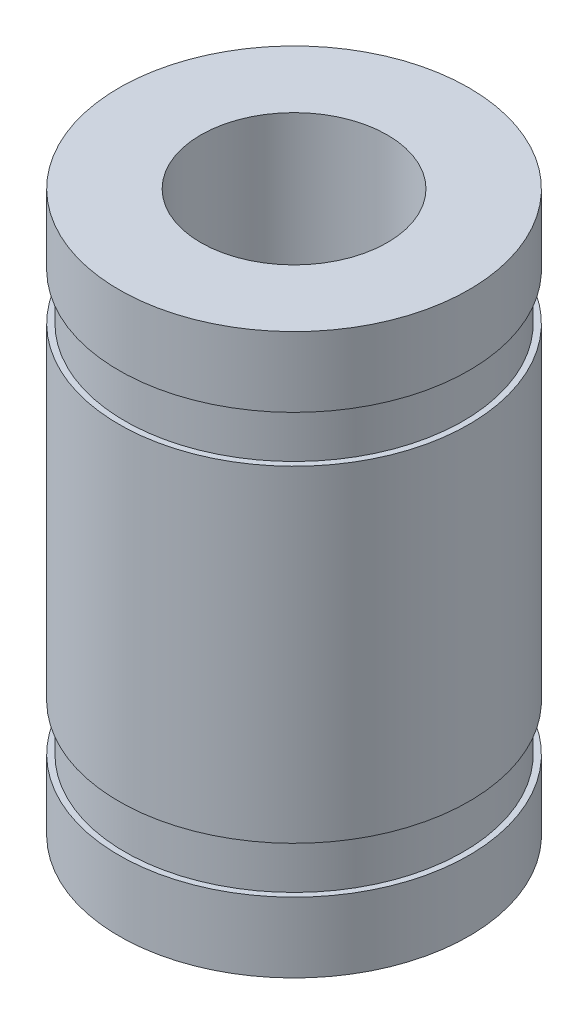
ISO-10303-21;
HEADER;
FILE_DESCRIPTION(('STEP AP214'),'2;1');
FILE_NAME('part.step','',(''),(''),'','','');
FILE_SCHEMA(('AUTOMOTIVE_DESIGN { 1 0 10303 214 1 1 1 1 }'));
ENDSEC;
DATA;
#1=APPLICATION_CONTEXT('core data for automotive mechanical design processes');
#2=APPLICATION_PROTOCOL_DEFINITION('international standard','automotive_design',2000,#1);
#3=PRODUCT_CONTEXT('',#1,'mechanical');
#4=PRODUCT('Part','Part','',(#3));
#5=PRODUCT_RELATED_PRODUCT_CATEGORY('part','',(#4));
#6=PRODUCT_DEFINITION_FORMATION('','',#4);
#7=PRODUCT_DEFINITION_CONTEXT('part definition',#1,'design');
#8=PRODUCT_DEFINITION('design','',#6,#7);
#9=PRODUCT_DEFINITION_SHAPE('','',#8);
#10=(LENGTH_UNIT() NAMED_UNIT(*) SI_UNIT(.MILLI.,.METRE.));
#11=(NAMED_UNIT(*) PLANE_ANGLE_UNIT() SI_UNIT($,.RADIAN.));
#12=(NAMED_UNIT(*) SI_UNIT($,.STERADIAN.) SOLID_ANGLE_UNIT());
#13=UNCERTAINTY_MEASURE_WITH_UNIT(LENGTH_MEASURE(1.E-05),#10,'distance_accuracy_value','');
#14=(GEOMETRIC_REPRESENTATION_CONTEXT(3) GLOBAL_UNCERTAINTY_ASSIGNED_CONTEXT((#13)) GLOBAL_UNIT_ASSIGNED_CONTEXT((#10,
#11,#12)) REPRESENTATION_CONTEXT('',''));
#15=CARTESIAN_POINT('',(0.,0.,0.));
#16=DIRECTION('',(0.,0.,1.));
#17=DIRECTION('',(1.,0.,0.));
#18=AXIS2_PLACEMENT_3D('',#15,#16,#17);
#19=CARTESIAN_POINT('',(4.,-12.,0.));
#20=DIRECTION('',(0.,-1.,0.));
#21=DIRECTION('',(0.,0.,-1.));
#22=AXIS2_PLACEMENT_3D('',#19,#20,#21);
#23=PLANE('',#22);
#24=CARTESIAN_POINT('',(0.,-12.,0.));
#25=DIRECTION('',(0.,-1.,0.));
#26=DIRECTION('',(0.,0.,-1.));
#27=AXIS2_PLACEMENT_3D('',#24,#25,#26);
#28=CIRCLE('',#27,7.5);
#29=CARTESIAN_POINT('',(0.,-12.,-7.5));
#30=VERTEX_POINT('',#29);
#31=EDGE_CURVE('E10',#30,#30,#28,.T.);
#32=ORIENTED_EDGE('',*,*,#31,.T.);
#33=EDGE_LOOP('',(#32));
#34=FACE_BOUND('',#33,.T.);
#35=CARTESIAN_POINT('',(0.,-12.,0.));
#36=DIRECTION('',(0.,-1.,0.));
#37=DIRECTION('',(0.,0.,-1.));
#38=AXIS2_PLACEMENT_3D('',#35,#36,#37);
#39=CIRCLE('',#38,4.);
#40=CARTESIAN_POINT('',(0.,-12.,-4.));
#41=VERTEX_POINT('',#40);
#42=EDGE_CURVE('E61',#41,#41,#39,.T.);
#43=ORIENTED_EDGE('',*,*,#42,.F.);
#44=EDGE_LOOP('',(#43));
#45=FACE_BOUND('',#44,.T.);
#46=ADVANCED_FACE('F39',(#34,#45),#23,.T.);
#47=CARTESIAN_POINT('',(0.,-6.05862422167642,0.));
#48=DIRECTION('',(0.,-1.,0.));
#49=DIRECTION('',(0.,0.,-1.));
#50=AXIS2_PLACEMENT_3D('',#47,#48,#49);
#51=CYLINDRICAL_SURFACE('',#50,7.5);
#52=CARTESIAN_POINT('',(0.,-9.,0.));
#53=DIRECTION('',(0.,-1.,0.));
#54=DIRECTION('',(0.,0.,-1.));
#55=AXIS2_PLACEMENT_3D('',#52,#53,#54);
#56=CIRCLE('',#55,7.5);
#57=CARTESIAN_POINT('',(0.,-9.,-7.5));
#58=VERTEX_POINT('',#57);
#59=EDGE_CURVE('E45',#58,#58,#56,.T.);
#60=ORIENTED_EDGE('',*,*,#59,.T.);
#61=EDGE_LOOP('',(#60));
#62=FACE_BOUND('',#61,.T.);
#63=ORIENTED_EDGE('',*,*,#31,.F.);
#64=EDGE_LOOP('',(#63));
#65=FACE_BOUND('',#64,.T.);
#66=ADVANCED_FACE('F102',(#62,#65),#51,.T.);
#67=CARTESIAN_POINT('',(7.5,-9.,0.));
#68=DIRECTION('',(0.,1.,0.));
#69=DIRECTION('',(0.,0.,1.));
#70=AXIS2_PLACEMENT_3D('',#67,#68,#69);
#71=PLANE('',#70);
#72=CARTESIAN_POINT('',(0.,-9.,0.));
#73=DIRECTION('',(0.,-1.,0.));
#74=DIRECTION('',(0.,0.,-1.));
#75=AXIS2_PLACEMENT_3D('',#72,#73,#74);
#76=CIRCLE('',#75,7.25);
#77=CARTESIAN_POINT('',(0.,-9.,-7.25));
#78=VERTEX_POINT('',#77);
#79=EDGE_CURVE('E49',#78,#78,#76,.T.);
#80=ORIENTED_EDGE('',*,*,#79,.T.);
#81=EDGE_LOOP('',(#80));
#82=FACE_BOUND('',#81,.T.);
#83=ORIENTED_EDGE('',*,*,#59,.F.);
#84=EDGE_LOOP('',(#83));
#85=FACE_BOUND('',#84,.T.);
#86=ADVANCED_FACE('F106',(#82,#85),#71,.T.);
#87=CARTESIAN_POINT('',(0.,-6.05862422167642,0.));
#88=DIRECTION('',(0.,-1.,0.));
#89=DIRECTION('',(0.,0.,-1.));
#90=AXIS2_PLACEMENT_3D('',#87,#88,#89);
#91=CYLINDRICAL_SURFACE('',#90,7.25);
#92=CARTESIAN_POINT('',(0.,-7.,0.));
#93=DIRECTION('',(0.,-1.,0.));
#94=DIRECTION('',(0.,0.,-1.));
#95=AXIS2_PLACEMENT_3D('',#92,#93,#94);
#96=CIRCLE('',#95,7.25);
#97=CARTESIAN_POINT('',(0.,-7.,-7.25));
#98=VERTEX_POINT('',#97);
#99=EDGE_CURVE('E53',#98,#98,#96,.T.);
#100=ORIENTED_EDGE('',*,*,#99,.T.);
#101=EDGE_LOOP('',(#100));
#102=FACE_BOUND('',#101,.T.);
#103=ORIENTED_EDGE('',*,*,#79,.F.);
#104=EDGE_LOOP('',(#103));
#105=FACE_BOUND('',#104,.T.);
#106=ADVANCED_FACE('F112',(#102,#105),#91,.T.);
#107=CARTESIAN_POINT('',(7.25,-7.,0.));
#108=DIRECTION('',(0.,-1.,0.));
#109=DIRECTION('',(0.,0.,-1.));
#110=AXIS2_PLACEMENT_3D('',#107,#108,#109);
#111=PLANE('',#110);
#112=CARTESIAN_POINT('',(0.,-7.,0.));
#113=DIRECTION('',(0.,-1.,0.));
#114=DIRECTION('',(0.,0.,-1.));
#115=AXIS2_PLACEMENT_3D('',#112,#113,#114);
#116=CIRCLE('',#115,7.5);
#117=CARTESIAN_POINT('',(0.,-7.,-7.5));
#118=VERTEX_POINT('',#117);
#119=EDGE_CURVE('E58',#118,#118,#116,.T.);
#120=ORIENTED_EDGE('',*,*,#119,.T.);
#121=EDGE_LOOP('',(#120));
#122=FACE_BOUND('',#121,.T.);
#123=ORIENTED_EDGE('',*,*,#99,.F.);
#124=EDGE_LOOP('',(#123));
#125=FACE_BOUND('',#124,.T.);
#126=ADVANCED_FACE('F98',(#122,#125),#111,.T.);
#127=CARTESIAN_POINT('',(0.,-6.05862422167642,0.));
#128=DIRECTION('',(0.,-1.,0.));
#129=DIRECTION('',(0.,0.,-1.));
#130=AXIS2_PLACEMENT_3D('',#127,#128,#129);
#131=CYLINDRICAL_SURFACE('',#130,7.5);
#132=ORIENTED_EDGE('',*,*,#119,.F.);
#133=EDGE_LOOP('',(#132));
#134=FACE_BOUND('',#133,.T.);
#135=CARTESIAN_POINT('',(0.,7.,0.));
#136=DIRECTION('',(0.,-1.,0.));
#137=DIRECTION('',(0.,0.,-1.));
#138=AXIS2_PLACEMENT_3D('',#135,#136,#137);
#139=CIRCLE('',#138,7.5);
#140=CARTESIAN_POINT('',(0.,7.,-7.5));
#141=VERTEX_POINT('',#140);
#142=EDGE_CURVE('E77',#141,#141,#139,.T.);
#143=ORIENTED_EDGE('',*,*,#142,.T.);
#144=EDGE_LOOP('',(#143));
#145=FACE_BOUND('',#144,.T.);
#146=ADVANCED_FACE('F88',(#134,#145),#131,.T.);
#147=CARTESIAN_POINT('',(0.,-6.05862422167642,0.));
#148=DIRECTION('',(0.,-1.,0.));
#149=DIRECTION('',(0.,0.,-1.));
#150=AXIS2_PLACEMENT_3D('',#147,#148,#149);
#151=CYLINDRICAL_SURFACE('',#150,4.);
#152=ORIENTED_EDGE('',*,*,#42,.T.);
#153=EDGE_LOOP('',(#152));
#154=FACE_BOUND('',#153,.T.);
#155=CARTESIAN_POINT('',(0.,12.,0.));
#156=DIRECTION('',(0.,-1.,0.));
#157=DIRECTION('',(0.,0.,-1.));
#158=AXIS2_PLACEMENT_3D('',#155,#156,#157);
#159=CIRCLE('',#158,4.);
#160=CARTESIAN_POINT('',(0.,12.,-4.));
#161=VERTEX_POINT('',#160);
#162=EDGE_CURVE('E80',#161,#161,#159,.T.);
#163=ORIENTED_EDGE('',*,*,#162,.F.);
#164=EDGE_LOOP('',(#163));
#165=FACE_BOUND('',#164,.T.);
#166=ADVANCED_FACE('F86',(#154,#165),#151,.F.);
#167=CARTESIAN_POINT('',(4.,12.,0.));
#168=DIRECTION('',(0.,1.,0.));
#169=DIRECTION('',(0.,0.,-1.));
#170=AXIS2_PLACEMENT_3D('',#167,#168,#169);
#171=PLANE('',#170);
#172=CARTESIAN_POINT('',(0.,12.,0.));
#173=DIRECTION('',(0.,-1.,0.));
#174=DIRECTION('',(0.,0.,-1.));
#175=AXIS2_PLACEMENT_3D('',#172,#173,#174);
#176=CIRCLE('',#175,7.5);
#177=CARTESIAN_POINT('',(0.,12.,-7.5));
#178=VERTEX_POINT('',#177);
#179=EDGE_CURVE('E65',#178,#178,#176,.T.);
#180=ORIENTED_EDGE('',*,*,#179,.F.);
#181=EDGE_LOOP('',(#180));
#182=FACE_BOUND('',#181,.T.);
#183=ORIENTED_EDGE('',*,*,#162,.T.);
#184=EDGE_LOOP('',(#183));
#185=FACE_BOUND('',#184,.T.);
#186=ADVANCED_FACE('F84',(#182,#185),#171,.T.);
#187=CARTESIAN_POINT('',(0.,6.05862422167642,0.));
#188=DIRECTION('',(0.,1.,0.));
#189=DIRECTION('',(0.,0.,-1.));
#190=AXIS2_PLACEMENT_3D('',#187,#188,#189);
#191=CYLINDRICAL_SURFACE('',#190,7.5);
#192=CARTESIAN_POINT('',(0.,9.,0.));
#193=DIRECTION('',(0.,-1.,0.));
#194=DIRECTION('',(0.,0.,-1.));
#195=AXIS2_PLACEMENT_3D('',#192,#193,#194);
#196=CIRCLE('',#195,7.5);
#197=CARTESIAN_POINT('',(0.,9.,-7.5));
#198=VERTEX_POINT('',#197);
#199=EDGE_CURVE('E68',#198,#198,#196,.T.);
#200=ORIENTED_EDGE('',*,*,#199,.F.);
#201=EDGE_LOOP('',(#200));
#202=FACE_BOUND('',#201,.T.);
#203=ORIENTED_EDGE('',*,*,#179,.T.);
#204=EDGE_LOOP('',(#203));
#205=FACE_BOUND('',#204,.T.);
#206=ADVANCED_FACE('F95',(#202,#205),#191,.T.);
#207=CARTESIAN_POINT('',(7.5,9.,0.));
#208=DIRECTION('',(0.,-1.,0.));
#209=DIRECTION('',(0.,0.,1.));
#210=AXIS2_PLACEMENT_3D('',#207,#208,#209);
#211=PLANE('',#210);
#212=CARTESIAN_POINT('',(0.,9.,0.));
#213=DIRECTION('',(0.,-1.,0.));
#214=DIRECTION('',(0.,0.,-1.));
#215=AXIS2_PLACEMENT_3D('',#212,#213,#214);
#216=CIRCLE('',#215,7.25);
#217=CARTESIAN_POINT('',(0.,9.,-7.25));
#218=VERTEX_POINT('',#217);
#219=EDGE_CURVE('E71',#218,#218,#216,.T.);
#220=ORIENTED_EDGE('',*,*,#219,.F.);
#221=EDGE_LOOP('',(#220));
#222=FACE_BOUND('',#221,.T.);
#223=ORIENTED_EDGE('',*,*,#199,.T.);
#224=EDGE_LOOP('',(#223));
#225=FACE_BOUND('',#224,.T.);
#226=ADVANCED_FACE('F142',(#222,#225),#211,.T.);
#227=CARTESIAN_POINT('',(0.,6.05862422167642,0.));
#228=DIRECTION('',(0.,1.,0.));
#229=DIRECTION('',(0.,0.,-1.));
#230=AXIS2_PLACEMENT_3D('',#227,#228,#229);
#231=CYLINDRICAL_SURFACE('',#230,7.25);
#232=CARTESIAN_POINT('',(0.,7.,0.));
#233=DIRECTION('',(0.,-1.,0.));
#234=DIRECTION('',(0.,0.,-1.));
#235=AXIS2_PLACEMENT_3D('',#232,#233,#234);
#236=CIRCLE('',#235,7.25);
#237=CARTESIAN_POINT('',(0.,7.,-7.25));
#238=VERTEX_POINT('',#237);
#239=EDGE_CURVE('E74',#238,#238,#236,.T.);
#240=ORIENTED_EDGE('',*,*,#239,.F.);
#241=EDGE_LOOP('',(#240));
#242=FACE_BOUND('',#241,.T.);
#243=ORIENTED_EDGE('',*,*,#219,.T.);
#244=EDGE_LOOP('',(#243));
#245=FACE_BOUND('',#244,.T.);
#246=ADVANCED_FACE('F136',(#242,#245),#231,.T.);
#247=CARTESIAN_POINT('',(7.25,7.,0.));
#248=DIRECTION('',(0.,1.,0.));
#249=DIRECTION('',(0.,0.,-1.));
#250=AXIS2_PLACEMENT_3D('',#247,#248,#249);
#251=PLANE('',#250);
#252=ORIENTED_EDGE('',*,*,#142,.F.);
#253=EDGE_LOOP('',(#252));
#254=FACE_BOUND('',#253,.T.);
#255=ORIENTED_EDGE('',*,*,#239,.T.);
#256=EDGE_LOOP('',(#255));
#257=FACE_BOUND('',#256,.T.);
#258=ADVANCED_FACE('F133',(#254,#257),#251,.T.);
#259=CLOSED_SHELL('',(#46,#66,#86,#106,#126,#146,#166,#186,#206,#226,#246,#258));
#260=MANIFOLD_SOLID_BREP('B2',#259);
#261=ADVANCED_BREP_SHAPE_REPRESENTATION('',(#18,#260),#14);
#262=SHAPE_DEFINITION_REPRESENTATION(#9,#261);
ENDSEC;
END-ISO-10303-21;
